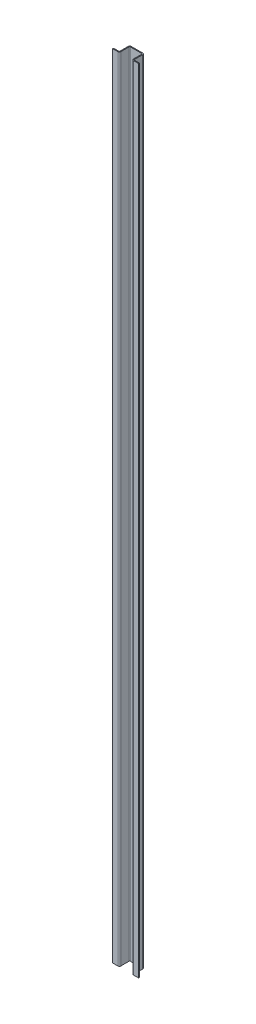
ISO-10303-21;
HEADER;
FILE_DESCRIPTION(('STEP AP214'),'2;1');
FILE_NAME('part.step','',(''),(''),'','','');
FILE_SCHEMA(('AUTOMOTIVE_DESIGN { 1 0 10303 214 1 1 1 1 }'));
ENDSEC;
DATA;
#1=APPLICATION_CONTEXT('core data for automotive mechanical design processes');
#2=APPLICATION_PROTOCOL_DEFINITION('international standard','automotive_design',2000,#1);
#3=PRODUCT_CONTEXT('',#1,'mechanical');
#4=PRODUCT('Part','Part','',(#3));
#5=PRODUCT_RELATED_PRODUCT_CATEGORY('part','',(#4));
#6=PRODUCT_DEFINITION_FORMATION('','',#4);
#7=PRODUCT_DEFINITION_CONTEXT('part definition',#1,'design');
#8=PRODUCT_DEFINITION('design','',#6,#7);
#9=PRODUCT_DEFINITION_SHAPE('','',#8);
#10=(LENGTH_UNIT() NAMED_UNIT(*) SI_UNIT(.MILLI.,.METRE.));
#11=(NAMED_UNIT(*) PLANE_ANGLE_UNIT() SI_UNIT($,.RADIAN.));
#12=(NAMED_UNIT(*) SI_UNIT($,.STERADIAN.) SOLID_ANGLE_UNIT());
#13=UNCERTAINTY_MEASURE_WITH_UNIT(LENGTH_MEASURE(1.E-05),#10,'distance_accuracy_value','');
#14=(GEOMETRIC_REPRESENTATION_CONTEXT(3) GLOBAL_UNCERTAINTY_ASSIGNED_CONTEXT((#13)) GLOBAL_UNIT_ASSIGNED_CONTEXT((#10,
#11,#12)) REPRESENTATION_CONTEXT('',''));
#15=CARTESIAN_POINT('',(0.,0.,0.));
#16=DIRECTION('',(0.,0.,1.));
#17=DIRECTION('',(1.,0.,0.));
#18=AXIS2_PLACEMENT_3D('',#15,#16,#17);
#19=CARTESIAN_POINT('',(-184.5,-687.500000000001,-18.5));
#20=DIRECTION('',(0.,1.,0.));
#21=DIRECTION('',(0.,0.,1.));
#22=AXIS2_PLACEMENT_3D('',#19,#20,#21);
#23=CYLINDRICAL_SURFACE('',#22,1.);
#24=DIRECTION('',(0.,1.,0.));
#25=VECTOR('',#24,1.);
#26=CARTESIAN_POINT('',(-184.5,-687.500000000001,-19.5));
#27=LINE('',#26,#25);
#28=CARTESIAN_POINT('',(-184.5,687.499999999999,-19.5));
#29=VERTEX_POINT('',#28);
#30=CARTESIAN_POINT('',(-184.5,-687.500000000001,-19.5));
#31=VERTEX_POINT('',#30);
#32=EDGE_CURVE('E135',#29,#31,#27,.F.);
#33=ORIENTED_EDGE('',*,*,#32,.T.);
#34=CARTESIAN_POINT('',(-184.5,-687.500000000001,-18.5));
#35=DIRECTION('',(0.,1.,0.));
#36=DIRECTION('',(0.,0.,1.));
#37=AXIS2_PLACEMENT_3D('',#34,#35,#36);
#38=CIRCLE('',#37,1.);
#39=CARTESIAN_POINT('',(-183.5,-687.500000000001,-18.5));
#40=VERTEX_POINT('',#39);
#41=EDGE_CURVE('E19',#40,#31,#38,.T.);
#42=ORIENTED_EDGE('',*,*,#41,.F.);
#43=DIRECTION('',(0.,1.,0.));
#44=VECTOR('',#43,1.);
#45=CARTESIAN_POINT('',(-183.5,-687.500000000001,-18.5));
#46=LINE('',#45,#44);
#47=CARTESIAN_POINT('',(-183.5,687.499999999999,-18.5));
#48=VERTEX_POINT('',#47);
#49=EDGE_CURVE('E132',#40,#48,#46,.T.);
#50=ORIENTED_EDGE('',*,*,#49,.T.);
#51=CARTESIAN_POINT('',(-184.5,687.499999999999,-18.5));
#52=DIRECTION('',(0.,1.,0.));
#53=DIRECTION('',(0.,0.,1.));
#54=AXIS2_PLACEMENT_3D('',#51,#52,#53);
#55=CIRCLE('',#54,1.);
#56=EDGE_CURVE('E140',#29,#48,#55,.F.);
#57=ORIENTED_EDGE('',*,*,#56,.F.);
#58=EDGE_LOOP('',(#33,#42,#50,#57));
#59=FACE_BOUND('',#58,.T.);
#60=ADVANCED_FACE('F16',(#59),#23,.F.);
#61=CARTESIAN_POINT('',(-172.,-687.500000000001,-1.5));
#62=DIRECTION('',(1.,0.,0.));
#63=DIRECTION('',(0.,0.,-1.));
#64=AXIS2_PLACEMENT_3D('',#61,#62,#63);
#65=PLANE('',#64);
#66=DIRECTION('',(0.,1.,0.));
#67=VECTOR('',#66,1.);
#68=CARTESIAN_POINT('',(-172.,-687.500000000001,-3.));
#69=LINE('',#68,#67);
#70=CARTESIAN_POINT('',(-172.,687.499999999999,-3.));
#71=VERTEX_POINT('',#70);
#72=CARTESIAN_POINT('',(-172.,-687.500000000001,-3.));
#73=VERTEX_POINT('',#72);
#74=EDGE_CURVE('E230',#71,#73,#69,.F.);
#75=ORIENTED_EDGE('',*,*,#74,.F.);
#76=DIRECTION('',(0.,0.,-1.));
#77=VECTOR('',#76,1.);
#78=CARTESIAN_POINT('',(-172.,687.499999999999,-1.5));
#79=LINE('',#78,#77);
#80=CARTESIAN_POINT('',(-172.,687.499999999999,-1.5));
#81=VERTEX_POINT('',#80);
#82=EDGE_CURVE('E259',#71,#81,#79,.F.);
#83=ORIENTED_EDGE('',*,*,#82,.T.);
#84=DIRECTION('',(0.,1.,0.));
#85=VECTOR('',#84,1.);
#86=CARTESIAN_POINT('',(-172.,-687.500000000001,-1.5));
#87=LINE('',#86,#85);
#88=CARTESIAN_POINT('',(-172.,-687.500000000001,-1.5));
#89=VERTEX_POINT('',#88);
#90=EDGE_CURVE('E237',#81,#89,#87,.F.);
#91=ORIENTED_EDGE('',*,*,#90,.T.);
#92=DIRECTION('',(0.,0.,-1.));
#93=VECTOR('',#92,1.);
#94=CARTESIAN_POINT('',(-172.,-687.500000000001,-1.5));
#95=LINE('',#94,#93);
#96=EDGE_CURVE('E263',#89,#73,#95,.T.);
#97=ORIENTED_EDGE('',*,*,#96,.T.);
#98=EDGE_LOOP('',(#75,#83,#91,#97));
#99=FACE_BOUND('',#98,.T.);
#100=ADVANCED_FACE('F345',(#99),#65,.T.);
#101=CARTESIAN_POINT('',(-181.,-687.500000000001,-4.));
#102=DIRECTION('',(0.,1.,0.));
#103=DIRECTION('',(0.,0.,1.));
#104=AXIS2_PLACEMENT_3D('',#101,#102,#103);
#105=CYLINDRICAL_SURFACE('',#104,1.);
#106=DIRECTION('',(0.,1.,0.));
#107=VECTOR('',#106,1.);
#108=CARTESIAN_POINT('',(-181.,-687.500000000001,-3.));
#109=LINE('',#108,#107);
#110=CARTESIAN_POINT('',(-181.,-687.500000000001,-3.));
#111=VERTEX_POINT('',#110);
#112=CARTESIAN_POINT('',(-181.,687.499999999999,-3.));
#113=VERTEX_POINT('',#112);
#114=EDGE_CURVE('E227',#111,#113,#109,.T.);
#115=ORIENTED_EDGE('',*,*,#114,.F.);
#116=CARTESIAN_POINT('',(-181.,-687.500000000001,-4.));
#117=DIRECTION('',(0.,1.,0.));
#118=DIRECTION('',(0.,0.,1.));
#119=AXIS2_PLACEMENT_3D('',#116,#117,#118);
#120=CIRCLE('',#119,1.);
#121=CARTESIAN_POINT('',(-182.,-687.500000000001,-4.));
#122=VERTEX_POINT('',#121);
#123=EDGE_CURVE('E262',#122,#111,#120,.T.);
#124=ORIENTED_EDGE('',*,*,#123,.F.);
#125=DIRECTION('',(0.,1.,0.));
#126=VECTOR('',#125,1.);
#127=CARTESIAN_POINT('',(-182.,-687.500000000001,-4.));
#128=LINE('',#127,#126);
#129=CARTESIAN_POINT('',(-182.,687.499999999999,-4.));
#130=VERTEX_POINT('',#129);
#131=EDGE_CURVE('E221',#130,#122,#128,.F.);
#132=ORIENTED_EDGE('',*,*,#131,.F.);
#133=CARTESIAN_POINT('',(-181.,687.499999999999,-4.));
#134=DIRECTION('',(0.,1.,0.));
#135=DIRECTION('',(0.,0.,1.));
#136=AXIS2_PLACEMENT_3D('',#133,#134,#135);
#137=CIRCLE('',#136,1.);
#138=EDGE_CURVE('E294',#113,#130,#137,.F.);
#139=ORIENTED_EDGE('',*,*,#138,.F.);
#140=EDGE_LOOP('',(#115,#124,#132,#139));
#141=FACE_BOUND('',#140,.T.);
#142=ADVANCED_FACE('F526',(#141),#105,.F.);
#143=CARTESIAN_POINT('',(-208.,-687.500000000001,-4.));
#144=DIRECTION('',(0.,1.,0.));
#145=DIRECTION('',(0.,0.,1.));
#146=AXIS2_PLACEMENT_3D('',#143,#144,#145);
#147=CYLINDRICAL_SURFACE('',#146,1.);
#148=DIRECTION('',(0.,1.,0.));
#149=VECTOR('',#148,1.);
#150=CARTESIAN_POINT('',(-207.,-687.500000000001,-4.));
#151=LINE('',#150,#149);
#152=CARTESIAN_POINT('',(-207.,-687.500000000001,-4.));
#153=VERTEX_POINT('',#152);
#154=CARTESIAN_POINT('',(-207.,687.499999999999,-4.));
#155=VERTEX_POINT('',#154);
#156=EDGE_CURVE('E214',#153,#155,#151,.T.);
#157=ORIENTED_EDGE('',*,*,#156,.F.);
#158=CARTESIAN_POINT('',(-208.,-687.500000000001,-4.));
#159=DIRECTION('',(0.,1.,0.));
#160=DIRECTION('',(0.,0.,1.));
#161=AXIS2_PLACEMENT_3D('',#158,#159,#160);
#162=CIRCLE('',#161,1.);
#163=CARTESIAN_POINT('',(-208.,-687.500000000001,-3.));
#164=VERTEX_POINT('',#163);
#165=EDGE_CURVE('E292',#164,#153,#162,.T.);
#166=ORIENTED_EDGE('',*,*,#165,.F.);
#167=DIRECTION('',(0.,1.,0.));
#168=VECTOR('',#167,1.);
#169=CARTESIAN_POINT('',(-208.,-687.500000000001,-3.));
#170=LINE('',#169,#168);
#171=CARTESIAN_POINT('',(-208.,687.499999999999,-3.));
#172=VERTEX_POINT('',#171);
#173=EDGE_CURVE('E211',#172,#164,#170,.F.);
#174=ORIENTED_EDGE('',*,*,#173,.F.);
#175=CARTESIAN_POINT('',(-208.,687.499999999999,-4.));
#176=DIRECTION('',(0.,1.,0.));
#177=DIRECTION('',(0.,0.,1.));
#178=AXIS2_PLACEMENT_3D('',#175,#176,#177);
#179=CIRCLE('',#178,1.);
#180=EDGE_CURVE('E251',#155,#172,#179,.F.);
#181=ORIENTED_EDGE('',*,*,#180,.F.);
#182=EDGE_LOOP('',(#157,#166,#174,#181));
#183=FACE_BOUND('',#182,.T.);
#184=ADVANCED_FACE('F401',(#183),#147,.F.);
#185=CARTESIAN_POINT('',(-217.,-687.500000000001,-3.));
#186=DIRECTION('',(-1.,0.,0.));
#187=DIRECTION('',(0.,0.,1.));
#188=AXIS2_PLACEMENT_3D('',#185,#186,#187);
#189=PLANE('',#188);
#190=DIRECTION('',(0.,1.,0.));
#191=VECTOR('',#190,1.);
#192=CARTESIAN_POINT('',(-217.,-687.500000000001,-1.5));
#193=LINE('',#192,#191);
#194=CARTESIAN_POINT('',(-217.,-687.500000000001,-1.5));
#195=VERTEX_POINT('',#194);
#196=CARTESIAN_POINT('',(-217.,687.499999999999,-1.5));
#197=VERTEX_POINT('',#196);
#198=EDGE_CURVE('E205',#195,#197,#193,.T.);
#199=ORIENTED_EDGE('',*,*,#198,.T.);
#200=DIRECTION('',(0.,0.,1.));
#201=VECTOR('',#200,1.);
#202=CARTESIAN_POINT('',(-217.,687.499999999999,-3.));
#203=LINE('',#202,#201);
#204=CARTESIAN_POINT('',(-217.,687.499999999999,-3.));
#205=VERTEX_POINT('',#204);
#206=EDGE_CURVE('E250',#197,#205,#203,.F.);
#207=ORIENTED_EDGE('',*,*,#206,.T.);
#208=DIRECTION('',(0.,1.,0.));
#209=VECTOR('',#208,1.);
#210=CARTESIAN_POINT('',(-217.,-687.500000000001,-3.));
#211=LINE('',#210,#209);
#212=CARTESIAN_POINT('',(-217.,-687.500000000001,-3.));
#213=VERTEX_POINT('',#212);
#214=EDGE_CURVE('E208',#213,#205,#211,.T.);
#215=ORIENTED_EDGE('',*,*,#214,.F.);
#216=DIRECTION('',(0.,0.,1.));
#217=VECTOR('',#216,1.);
#218=CARTESIAN_POINT('',(-217.,-687.500000000001,-3.));
#219=LINE('',#218,#217);
#220=EDGE_CURVE('E247',#213,#195,#219,.T.);
#221=ORIENTED_EDGE('',*,*,#220,.T.);
#222=EDGE_LOOP('',(#199,#207,#215,#221));
#223=FACE_BOUND('',#222,.T.);
#224=ADVANCED_FACE('F328',(#223),#189,.T.);
#225=CARTESIAN_POINT('',(-204.5,-687.500000000001,-18.5));
#226=DIRECTION('',(0.,1.,0.));
#227=DIRECTION('',(0.,0.,1.));
#228=AXIS2_PLACEMENT_3D('',#225,#226,#227);
#229=CYLINDRICAL_SURFACE('',#228,1.);
#230=DIRECTION('',(0.,1.,0.));
#231=VECTOR('',#230,1.);
#232=CARTESIAN_POINT('',(-205.5,-687.500000000001,-18.5));
#233=LINE('',#232,#231);
#234=CARTESIAN_POINT('',(-205.5,687.499999999999,-18.5));
#235=VERTEX_POINT('',#234);
#236=CARTESIAN_POINT('',(-205.5,-687.500000000001,-18.5));
#237=VERTEX_POINT('',#236);
#238=EDGE_CURVE('E200',#235,#237,#233,.F.);
#239=ORIENTED_EDGE('',*,*,#238,.T.);
#240=CARTESIAN_POINT('',(-204.5,-687.500000000001,-18.5));
#241=DIRECTION('',(0.,1.,0.));
#242=DIRECTION('',(0.,0.,1.));
#243=AXIS2_PLACEMENT_3D('',#240,#241,#242);
#244=CIRCLE('',#243,1.);
#245=CARTESIAN_POINT('',(-204.5,-687.500000000001,-19.5));
#246=VERTEX_POINT('',#245);
#247=EDGE_CURVE('E256',#246,#237,#244,.T.);
#248=ORIENTED_EDGE('',*,*,#247,.F.);
#249=DIRECTION('',(0.,1.,0.));
#250=VECTOR('',#249,1.);
#251=CARTESIAN_POINT('',(-204.5,-687.500000000001,-19.5));
#252=LINE('',#251,#250);
#253=CARTESIAN_POINT('',(-204.5,687.499999999999,-19.5));
#254=VERTEX_POINT('',#253);
#255=EDGE_CURVE('E149',#246,#254,#252,.T.);
#256=ORIENTED_EDGE('',*,*,#255,.T.);
#257=CARTESIAN_POINT('',(-204.5,687.499999999999,-18.5));
#258=DIRECTION('',(0.,1.,0.));
#259=DIRECTION('',(0.,0.,1.));
#260=AXIS2_PLACEMENT_3D('',#257,#258,#259);
#261=CIRCLE('',#260,1.);
#262=EDGE_CURVE('E246',#235,#254,#261,.F.);
#263=ORIENTED_EDGE('',*,*,#262,.F.);
#264=EDGE_LOOP('',(#239,#248,#256,#263));
#265=FACE_BOUND('',#264,.T.);
#266=ADVANCED_FACE('F307',(#265),#229,.F.);
#267=CARTESIAN_POINT('',(-182.,-687.500000000001,-19.5));
#268=DIRECTION('',(0.,0.,-1.));
#269=DIRECTION('',(-1.,0.,0.));
#270=AXIS2_PLACEMENT_3D('',#267,#268,#269);
#271=PLANE('',#270);
#272=ORIENTED_EDGE('',*,*,#255,.F.);
#273=DIRECTION('',(1.,0.,0.));
#274=VECTOR('',#273,1.);
#275=CARTESIAN_POINT('',(-183.5,-687.500000000001,-19.5));
#276=LINE('',#275,#274);
#277=EDGE_CURVE('E194',#31,#246,#276,.F.);
#278=ORIENTED_EDGE('',*,*,#277,.F.);
#279=ORIENTED_EDGE('',*,*,#32,.F.);
#280=DIRECTION('',(1.,0.,0.));
#281=VECTOR('',#280,1.);
#282=CARTESIAN_POINT('',(-205.5,687.499999999999,-19.5));
#283=LINE('',#282,#281);
#284=EDGE_CURVE('E223',#254,#29,#283,.T.);
#285=ORIENTED_EDGE('',*,*,#284,.F.);
#286=EDGE_LOOP('',(#272,#278,#279,#285));
#287=FACE_BOUND('',#286,.T.);
#288=ADVANCED_FACE('F303',(#287),#271,.F.);
#289=CARTESIAN_POINT('',(-183.5,-687.500000000001,-3.));
#290=DIRECTION('',(1.,0.,0.));
#291=DIRECTION('',(0.,0.,-1.));
#292=AXIS2_PLACEMENT_3D('',#289,#290,#291);
#293=PLANE('',#292);
#294=ORIENTED_EDGE('',*,*,#49,.F.);
#295=DIRECTION('',(0.,0.,-1.));
#296=VECTOR('',#295,1.);
#297=CARTESIAN_POINT('',(-183.5,-687.500000000001,-18.5));
#298=LINE('',#297,#296);
#299=CARTESIAN_POINT('',(-183.5,-687.500000000001,-4.));
#300=VERTEX_POINT('',#299);
#301=EDGE_CURVE('E144',#300,#40,#298,.T.);
#302=ORIENTED_EDGE('',*,*,#301,.F.);
#303=DIRECTION('',(0.,1.,0.));
#304=VECTOR('',#303,1.);
#305=CARTESIAN_POINT('',(-183.5,-687.500000000001,-4.));
#306=LINE('',#305,#304);
#307=CARTESIAN_POINT('',(-183.5,687.499999999999,-4.));
#308=VERTEX_POINT('',#307);
#309=EDGE_CURVE('E148',#308,#300,#306,.F.);
#310=ORIENTED_EDGE('',*,*,#309,.F.);
#311=DIRECTION('',(0.,0.,1.));
#312=VECTOR('',#311,1.);
#313=CARTESIAN_POINT('',(-183.5,687.499999999999,-18.5));
#314=LINE('',#313,#312);
#315=EDGE_CURVE('E147',#48,#308,#314,.T.);
#316=ORIENTED_EDGE('',*,*,#315,.F.);
#317=EDGE_LOOP('',(#294,#302,#310,#316));
#318=FACE_BOUND('',#317,.T.);
#319=ADVANCED_FACE('F143',(#318),#293,.F.);
#320=CARTESIAN_POINT('',(-181.,-687.500000000001,-4.));
#321=DIRECTION('',(0.,1.,0.));
#322=DIRECTION('',(0.,0.,1.));
#323=AXIS2_PLACEMENT_3D('',#320,#321,#322);
#324=CYLINDRICAL_SURFACE('',#323,2.5);
#325=DIRECTION('',(0.,1.,0.));
#326=VECTOR('',#325,1.);
#327=CARTESIAN_POINT('',(-181.,-687.500000000001,-1.5));
#328=LINE('',#327,#326);
#329=CARTESIAN_POINT('',(-181.,-687.500000000001,-1.5));
#330=VERTEX_POINT('',#329);
#331=CARTESIAN_POINT('',(-181.,687.499999999999,-1.5));
#332=VERTEX_POINT('',#331);
#333=EDGE_CURVE('E233',#330,#332,#328,.T.);
#334=ORIENTED_EDGE('',*,*,#333,.T.);
#335=CARTESIAN_POINT('',(-181.,687.499999999999,-4.));
#336=DIRECTION('',(0.,1.,0.));
#337=DIRECTION('',(0.,0.,1.));
#338=AXIS2_PLACEMENT_3D('',#335,#336,#337);
#339=CIRCLE('',#338,2.5);
#340=EDGE_CURVE('E281',#308,#332,#339,.T.);
#341=ORIENTED_EDGE('',*,*,#340,.F.);
#342=ORIENTED_EDGE('',*,*,#309,.T.);
#343=CARTESIAN_POINT('',(-181.,-687.500000000001,-4.));
#344=DIRECTION('',(0.,1.,0.));
#345=DIRECTION('',(0.,0.,1.));
#346=AXIS2_PLACEMENT_3D('',#343,#344,#345);
#347=CIRCLE('',#346,2.5);
#348=EDGE_CURVE('E154',#330,#300,#347,.F.);
#349=ORIENTED_EDGE('',*,*,#348,.F.);
#350=EDGE_LOOP('',(#334,#341,#342,#349));
#351=FACE_BOUND('',#350,.T.);
#352=ADVANCED_FACE('F352',(#351),#324,.T.);
#353=CARTESIAN_POINT('',(-172.,-687.500000000001,-1.5));
#354=DIRECTION('',(0.,0.,-1.));
#355=DIRECTION('',(-1.,0.,0.));
#356=AXIS2_PLACEMENT_3D('',#353,#354,#355);
#357=PLANE('',#356);
#358=ORIENTED_EDGE('',*,*,#333,.F.);
#359=DIRECTION('',(1.,0.,0.));
#360=VECTOR('',#359,1.);
#361=CARTESIAN_POINT('',(-183.5,-687.500000000001,-1.5));
#362=LINE('',#361,#360);
#363=EDGE_CURVE('E160',#89,#330,#362,.F.);
#364=ORIENTED_EDGE('',*,*,#363,.F.);
#365=ORIENTED_EDGE('',*,*,#90,.F.);
#366=DIRECTION('',(1.,0.,0.));
#367=VECTOR('',#366,1.);
#368=CARTESIAN_POINT('',(-205.5,687.499999999999,-1.5));
#369=LINE('',#368,#367);
#370=EDGE_CURVE('E283',#332,#81,#369,.T.);
#371=ORIENTED_EDGE('',*,*,#370,.F.);
#372=EDGE_LOOP('',(#358,#364,#365,#371));
#373=FACE_BOUND('',#372,.T.);
#374=ADVANCED_FACE('F349',(#373),#357,.F.);
#375=CARTESIAN_POINT('',(-172.,-687.500000000001,-3.));
#376=DIRECTION('',(0.,0.,-1.));
#377=DIRECTION('',(-1.,0.,0.));
#378=AXIS2_PLACEMENT_3D('',#375,#376,#377);
#379=PLANE('',#378);
#380=ORIENTED_EDGE('',*,*,#114,.T.);
#381=DIRECTION('',(1.,0.,0.));
#382=VECTOR('',#381,1.);
#383=CARTESIAN_POINT('',(-205.5,687.499999999999,-3.));
#384=LINE('',#383,#382);
#385=EDGE_CURVE('E354',#71,#113,#384,.F.);
#386=ORIENTED_EDGE('',*,*,#385,.F.);
#387=ORIENTED_EDGE('',*,*,#74,.T.);
#388=DIRECTION('',(1.,0.,0.));
#389=VECTOR('',#388,1.);
#390=CARTESIAN_POINT('',(-183.5,-687.500000000001,-3.));
#391=LINE('',#390,#389);
#392=EDGE_CURVE('E167',#111,#73,#391,.T.);
#393=ORIENTED_EDGE('',*,*,#392,.F.);
#394=EDGE_LOOP('',(#380,#386,#387,#393));
#395=FACE_BOUND('',#394,.T.);
#396=ADVANCED_FACE('F476',(#395),#379,.T.);
#397=CARTESIAN_POINT('',(-182.,-687.500000000001,-3.));
#398=DIRECTION('',(1.,0.,0.));
#399=DIRECTION('',(0.,0.,-1.));
#400=AXIS2_PLACEMENT_3D('',#397,#398,#399);
#401=PLANE('',#400);
#402=DIRECTION('',(0.,1.,0.));
#403=VECTOR('',#402,1.);
#404=CARTESIAN_POINT('',(-182.,-687.500000000001,-18.5));
#405=LINE('',#404,#403);
#406=CARTESIAN_POINT('',(-182.,687.499999999999,-18.5));
#407=VERTEX_POINT('',#406);
#408=CARTESIAN_POINT('',(-182.,-687.500000000001,-18.5));
#409=VERTEX_POINT('',#408);
#410=EDGE_CURVE('E196',#407,#409,#405,.F.);
#411=ORIENTED_EDGE('',*,*,#410,.F.);
#412=DIRECTION('',(0.,0.,1.));
#413=VECTOR('',#412,1.);
#414=CARTESIAN_POINT('',(-182.,687.499999999999,-18.5));
#415=LINE('',#414,#413);
#416=EDGE_CURVE('E280',#130,#407,#415,.F.);
#417=ORIENTED_EDGE('',*,*,#416,.F.);
#418=ORIENTED_EDGE('',*,*,#131,.T.);
#419=DIRECTION('',(0.,0.,-1.));
#420=VECTOR('',#419,1.);
#421=CARTESIAN_POINT('',(-182.,-687.500000000001,-18.5));
#422=LINE('',#421,#420);
#423=EDGE_CURVE('E172',#409,#122,#422,.F.);
#424=ORIENTED_EDGE('',*,*,#423,.F.);
#425=EDGE_LOOP('',(#411,#417,#418,#424));
#426=FACE_BOUND('',#425,.T.);
#427=ADVANCED_FACE('F385',(#426),#401,.T.);
#428=CARTESIAN_POINT('',(-207.,-687.500000000001,-21.));
#429=DIRECTION('',(-1.,0.,0.));
#430=DIRECTION('',(0.,0.,1.));
#431=AXIS2_PLACEMENT_3D('',#428,#429,#430);
#432=PLANE('',#431);
#433=ORIENTED_EDGE('',*,*,#156,.T.);
#434=DIRECTION('',(0.,0.,1.));
#435=VECTOR('',#434,1.);
#436=CARTESIAN_POINT('',(-207.,687.499999999999,-18.5));
#437=LINE('',#436,#435);
#438=CARTESIAN_POINT('',(-207.,687.499999999999,-18.5));
#439=VERTEX_POINT('',#438);
#440=EDGE_CURVE('E276',#439,#155,#437,.T.);
#441=ORIENTED_EDGE('',*,*,#440,.F.);
#442=DIRECTION('',(0.,1.,0.));
#443=VECTOR('',#442,1.);
#444=CARTESIAN_POINT('',(-207.,-687.500000000001,-18.5));
#445=LINE('',#444,#443);
#446=CARTESIAN_POINT('',(-207.,-687.500000000001,-18.5));
#447=VERTEX_POINT('',#446);
#448=EDGE_CURVE('E158',#447,#439,#445,.T.);
#449=ORIENTED_EDGE('',*,*,#448,.F.);
#450=DIRECTION('',(0.,0.,-1.));
#451=VECTOR('',#450,1.);
#452=CARTESIAN_POINT('',(-207.,-687.500000000001,-18.5));
#453=LINE('',#452,#451);
#454=EDGE_CURVE('E178',#153,#447,#453,.T.);
#455=ORIENTED_EDGE('',*,*,#454,.F.);
#456=EDGE_LOOP('',(#433,#441,#449,#455));
#457=FACE_BOUND('',#456,.T.);
#458=ADVANCED_FACE('F396',(#457),#432,.T.);
#459=CARTESIAN_POINT('',(-207.,-687.500000000001,-3.));
#460=DIRECTION('',(0.,0.,-1.));
#461=DIRECTION('',(-1.,0.,0.));
#462=AXIS2_PLACEMENT_3D('',#459,#460,#461);
#463=PLANE('',#462);
#464=ORIENTED_EDGE('',*,*,#214,.T.);
#465=DIRECTION('',(1.,0.,0.));
#466=VECTOR('',#465,1.);
#467=CARTESIAN_POINT('',(-205.5,687.499999999999,-3.));
#468=LINE('',#467,#466);
#469=EDGE_CURVE('E372',#172,#205,#468,.F.);
#470=ORIENTED_EDGE('',*,*,#469,.F.);
#471=ORIENTED_EDGE('',*,*,#173,.T.);
#472=DIRECTION('',(1.,0.,0.));
#473=VECTOR('',#472,1.);
#474=CARTESIAN_POINT('',(-183.5,-687.500000000001,-3.));
#475=LINE('',#474,#473);
#476=EDGE_CURVE('E180',#213,#164,#475,.T.);
#477=ORIENTED_EDGE('',*,*,#476,.F.);
#478=EDGE_LOOP('',(#464,#470,#471,#477));
#479=FACE_BOUND('',#478,.T.);
#480=ADVANCED_FACE('F404',(#479),#463,.T.);
#481=CARTESIAN_POINT('',(-207.,-687.500000000001,-1.5));
#482=DIRECTION('',(0.,0.,-1.));
#483=DIRECTION('',(-1.,0.,0.));
#484=AXIS2_PLACEMENT_3D('',#481,#482,#483);
#485=PLANE('',#484);
#486=ORIENTED_EDGE('',*,*,#198,.F.);
#487=DIRECTION('',(1.,0.,0.));
#488=VECTOR('',#487,1.);
#489=CARTESIAN_POINT('',(-183.5,-687.500000000001,-1.5));
#490=LINE('',#489,#488);
#491=CARTESIAN_POINT('',(-208.,-687.500000000001,-1.5));
#492=VERTEX_POINT('',#491);
#493=EDGE_CURVE('E183',#492,#195,#490,.F.);
#494=ORIENTED_EDGE('',*,*,#493,.F.);
#495=DIRECTION('',(0.,1.,0.));
#496=VECTOR('',#495,1.);
#497=CARTESIAN_POINT('',(-208.,-687.500000000001,-1.5));
#498=LINE('',#497,#496);
#499=CARTESIAN_POINT('',(-208.,687.499999999999,-1.5));
#500=VERTEX_POINT('',#499);
#501=EDGE_CURVE('E203',#500,#492,#498,.F.);
#502=ORIENTED_EDGE('',*,*,#501,.F.);
#503=DIRECTION('',(1.,0.,0.));
#504=VECTOR('',#503,1.);
#505=CARTESIAN_POINT('',(-205.5,687.499999999999,-1.5));
#506=LINE('',#505,#504);
#507=EDGE_CURVE('E274',#197,#500,#506,.T.);
#508=ORIENTED_EDGE('',*,*,#507,.F.);
#509=EDGE_LOOP('',(#486,#494,#502,#508));
#510=FACE_BOUND('',#509,.T.);
#511=ADVANCED_FACE('F322',(#510),#485,.F.);
#512=CARTESIAN_POINT('',(-208.,-687.500000000001,-4.));
#513=DIRECTION('',(0.,1.,0.));
#514=DIRECTION('',(0.,0.,1.));
#515=AXIS2_PLACEMENT_3D('',#512,#513,#514);
#516=CYLINDRICAL_SURFACE('',#515,2.5);
#517=DIRECTION('',(0.,1.,0.));
#518=VECTOR('',#517,1.);
#519=CARTESIAN_POINT('',(-205.5,-687.500000000001,-4.));
#520=LINE('',#519,#518);
#521=CARTESIAN_POINT('',(-205.5,-687.500000000001,-4.));
#522=VERTEX_POINT('',#521);
#523=CARTESIAN_POINT('',(-205.5,687.499999999999,-4.));
#524=VERTEX_POINT('',#523);
#525=EDGE_CURVE('E197',#522,#524,#520,.T.);
#526=ORIENTED_EDGE('',*,*,#525,.T.);
#527=CARTESIAN_POINT('',(-208.,687.499999999999,-4.));
#528=DIRECTION('',(0.,1.,0.));
#529=DIRECTION('',(0.,0.,1.));
#530=AXIS2_PLACEMENT_3D('',#527,#528,#529);
#531=CIRCLE('',#530,2.5);
#532=EDGE_CURVE('E270',#500,#524,#531,.T.);
#533=ORIENTED_EDGE('',*,*,#532,.F.);
#534=ORIENTED_EDGE('',*,*,#501,.T.);
#535=CARTESIAN_POINT('',(-208.,-687.500000000001,-4.));
#536=DIRECTION('',(0.,1.,0.));
#537=DIRECTION('',(0.,0.,1.));
#538=AXIS2_PLACEMENT_3D('',#535,#536,#537);
#539=CIRCLE('',#538,2.5);
#540=EDGE_CURVE('E188',#522,#492,#539,.F.);
#541=ORIENTED_EDGE('',*,*,#540,.F.);
#542=EDGE_LOOP('',(#526,#533,#534,#541));
#543=FACE_BOUND('',#542,.T.);
#544=ADVANCED_FACE('F314',(#543),#516,.T.);
#545=CARTESIAN_POINT('',(-205.5,-687.500000000001,-21.));
#546=DIRECTION('',(-1.,0.,0.));
#547=DIRECTION('',(0.,0.,1.));
#548=AXIS2_PLACEMENT_3D('',#545,#546,#547);
#549=PLANE('',#548);
#550=ORIENTED_EDGE('',*,*,#525,.F.);
#551=DIRECTION('',(0.,0.,-1.));
#552=VECTOR('',#551,1.);
#553=CARTESIAN_POINT('',(-205.5,-687.500000000001,-18.5));
#554=LINE('',#553,#552);
#555=EDGE_CURVE('E191',#237,#522,#554,.F.);
#556=ORIENTED_EDGE('',*,*,#555,.F.);
#557=ORIENTED_EDGE('',*,*,#238,.F.);
#558=DIRECTION('',(0.,0.,1.));
#559=VECTOR('',#558,1.);
#560=CARTESIAN_POINT('',(-205.5,687.499999999999,-18.5));
#561=LINE('',#560,#559);
#562=EDGE_CURVE('E273',#524,#235,#561,.F.);
#563=ORIENTED_EDGE('',*,*,#562,.F.);
#564=EDGE_LOOP('',(#550,#556,#557,#563));
#565=FACE_BOUND('',#564,.T.);
#566=ADVANCED_FACE('F310',(#565),#549,.F.);
#567=CARTESIAN_POINT('',(-184.5,-687.500000000001,-18.5));
#568=DIRECTION('',(0.,1.,0.));
#569=DIRECTION('',(0.,0.,1.));
#570=AXIS2_PLACEMENT_3D('',#567,#568,#569);
#571=CYLINDRICAL_SURFACE('',#570,2.5);
#572=DIRECTION('',(0.,1.,0.));
#573=VECTOR('',#572,1.);
#574=CARTESIAN_POINT('',(-184.5,-687.500000000001,-21.));
#575=LINE('',#574,#573);
#576=CARTESIAN_POINT('',(-184.5,687.499999999999,-21.));
#577=VERTEX_POINT('',#576);
#578=CARTESIAN_POINT('',(-184.5,-687.500000000001,-21.));
#579=VERTEX_POINT('',#578);
#580=EDGE_CURVE('E365',#577,#579,#575,.F.);
#581=ORIENTED_EDGE('',*,*,#580,.F.);
#582=CARTESIAN_POINT('',(-184.5,687.499999999999,-18.5));
#583=DIRECTION('',(0.,1.,0.));
#584=DIRECTION('',(0.,0.,1.));
#585=AXIS2_PLACEMENT_3D('',#582,#583,#584);
#586=CIRCLE('',#585,2.5);
#587=EDGE_CURVE('E277',#407,#577,#586,.T.);
#588=ORIENTED_EDGE('',*,*,#587,.F.);
#589=ORIENTED_EDGE('',*,*,#410,.T.);
#590=CARTESIAN_POINT('',(-184.5,-687.500000000001,-18.5));
#591=DIRECTION('',(0.,1.,0.));
#592=DIRECTION('',(0.,0.,1.));
#593=AXIS2_PLACEMENT_3D('',#590,#591,#592);
#594=CIRCLE('',#593,2.5);
#595=EDGE_CURVE('E177',#579,#409,#594,.F.);
#596=ORIENTED_EDGE('',*,*,#595,.F.);
#597=EDGE_LOOP('',(#581,#588,#589,#596));
#598=FACE_BOUND('',#597,.T.);
#599=ADVANCED_FACE('F388',(#598),#571,.T.);
#600=CARTESIAN_POINT('',(-183.5,-687.500000000001,-18.5));
#601=DIRECTION('',(0.,-1.,0.));
#602=DIRECTION('',(0.,0.,-1.));
#603=AXIS2_PLACEMENT_3D('',#600,#601,#602);
#604=PLANE('',#603);
#605=ORIENTED_EDGE('',*,*,#301,.T.);
#606=ORIENTED_EDGE('',*,*,#41,.T.);
#607=ORIENTED_EDGE('',*,*,#277,.T.);
#608=ORIENTED_EDGE('',*,*,#247,.T.);
#609=ORIENTED_EDGE('',*,*,#555,.T.);
#610=ORIENTED_EDGE('',*,*,#540,.T.);
#611=ORIENTED_EDGE('',*,*,#493,.T.);
#612=ORIENTED_EDGE('',*,*,#220,.F.);
#613=ORIENTED_EDGE('',*,*,#476,.T.);
#614=ORIENTED_EDGE('',*,*,#165,.T.);
#615=ORIENTED_EDGE('',*,*,#454,.T.);
#616=CARTESIAN_POINT('',(-204.5,-687.500000000001,-18.5));
#617=DIRECTION('',(0.,1.,0.));
#618=DIRECTION('',(0.,0.,1.));
#619=AXIS2_PLACEMENT_3D('',#616,#617,#618);
#620=CIRCLE('',#619,2.5);
#621=CARTESIAN_POINT('',(-204.5,-687.500000000001,-21.));
#622=VERTEX_POINT('',#621);
#623=EDGE_CURVE('E155',#622,#447,#620,.T.);
#624=ORIENTED_EDGE('',*,*,#623,.F.);
#625=DIRECTION('',(-1.,0.,0.));
#626=VECTOR('',#625,1.);
#627=CARTESIAN_POINT('',(-182.,-687.500000000001,-21.));
#628=LINE('',#627,#626);
#629=EDGE_CURVE('E164',#579,#622,#628,.T.);
#630=ORIENTED_EDGE('',*,*,#629,.F.);
#631=ORIENTED_EDGE('',*,*,#595,.T.);
#632=ORIENTED_EDGE('',*,*,#423,.T.);
#633=ORIENTED_EDGE('',*,*,#123,.T.);
#634=ORIENTED_EDGE('',*,*,#392,.T.);
#635=ORIENTED_EDGE('',*,*,#96,.F.);
#636=ORIENTED_EDGE('',*,*,#363,.T.);
#637=ORIENTED_EDGE('',*,*,#348,.T.);
#638=EDGE_LOOP('',(#605,#606,#607,#608,#609,#610,#611,#612,#613,#614,#615,#624,#630,#631,#632,
#633,#634,#635,#636,#637));
#639=FACE_BOUND('',#638,.T.);
#640=ADVANCED_FACE('F151',(#639),#604,.T.);
#641=CARTESIAN_POINT('',(-204.5,-687.500000000001,-18.5));
#642=DIRECTION('',(0.,1.,0.));
#643=DIRECTION('',(0.,0.,1.));
#644=AXIS2_PLACEMENT_3D('',#641,#642,#643);
#645=CYLINDRICAL_SURFACE('',#644,2.5);
#646=ORIENTED_EDGE('',*,*,#448,.T.);
#647=CARTESIAN_POINT('',(-204.5,687.499999999999,-18.5));
#648=DIRECTION('',(0.,1.,0.));
#649=DIRECTION('',(0.,0.,1.));
#650=AXIS2_PLACEMENT_3D('',#647,#648,#649);
#651=CIRCLE('',#650,2.5);
#652=CARTESIAN_POINT('',(-204.5,687.499999999999,-21.));
#653=VERTEX_POINT('',#652);
#654=EDGE_CURVE('E34',#653,#439,#651,.T.);
#655=ORIENTED_EDGE('',*,*,#654,.F.);
#656=DIRECTION('',(0.,1.,0.));
#657=VECTOR('',#656,1.);
#658=CARTESIAN_POINT('',(-204.5,-687.500000000001,-21.));
#659=LINE('',#658,#657);
#660=EDGE_CURVE('E25',#622,#653,#659,.T.);
#661=ORIENTED_EDGE('',*,*,#660,.F.);
#662=ORIENTED_EDGE('',*,*,#623,.T.);
#663=EDGE_LOOP('',(#646,#655,#661,#662));
#664=FACE_BOUND('',#663,.T.);
#665=ADVANCED_FACE('F391',(#664),#645,.T.);
#666=CARTESIAN_POINT('',(-205.5,687.499999999999,-18.5));
#667=DIRECTION('',(0.,1.,0.));
#668=DIRECTION('',(0.,0.,1.));
#669=AXIS2_PLACEMENT_3D('',#666,#667,#668);
#670=PLANE('',#669);
#671=ORIENTED_EDGE('',*,*,#562,.T.);
#672=ORIENTED_EDGE('',*,*,#262,.T.);
#673=ORIENTED_EDGE('',*,*,#284,.T.);
#674=ORIENTED_EDGE('',*,*,#56,.T.);
#675=ORIENTED_EDGE('',*,*,#315,.T.);
#676=ORIENTED_EDGE('',*,*,#340,.T.);
#677=ORIENTED_EDGE('',*,*,#370,.T.);
#678=ORIENTED_EDGE('',*,*,#82,.F.);
#679=ORIENTED_EDGE('',*,*,#385,.T.);
#680=ORIENTED_EDGE('',*,*,#138,.T.);
#681=ORIENTED_EDGE('',*,*,#416,.T.);
#682=ORIENTED_EDGE('',*,*,#587,.T.);
#683=DIRECTION('',(-1.,0.,0.));
#684=VECTOR('',#683,1.);
#685=CARTESIAN_POINT('',(-182.,687.499999999999,-21.));
#686=LINE('',#685,#684);
#687=EDGE_CURVE('E11',#653,#577,#686,.F.);
#688=ORIENTED_EDGE('',*,*,#687,.F.);
#689=ORIENTED_EDGE('',*,*,#654,.T.);
#690=ORIENTED_EDGE('',*,*,#440,.T.);
#691=ORIENTED_EDGE('',*,*,#180,.T.);
#692=ORIENTED_EDGE('',*,*,#469,.T.);
#693=ORIENTED_EDGE('',*,*,#206,.F.);
#694=ORIENTED_EDGE('',*,*,#507,.T.);
#695=ORIENTED_EDGE('',*,*,#532,.T.);
#696=EDGE_LOOP('',(#671,#672,#673,#674,#675,#676,#677,#678,#679,#680,#681,#682,#688,#689,#690,
#691,#692,#693,#694,#695));
#697=FACE_BOUND('',#696,.T.);
#698=ADVANCED_FACE('F299',(#697),#670,.T.);
#699=CARTESIAN_POINT('',(-182.,-687.500000000001,-21.));
#700=DIRECTION('',(0.,0.,-1.));
#701=DIRECTION('',(-1.,0.,0.));
#702=AXIS2_PLACEMENT_3D('',#699,#700,#701);
#703=PLANE('',#702);
#704=ORIENTED_EDGE('',*,*,#660,.T.);
#705=ORIENTED_EDGE('',*,*,#687,.T.);
#706=ORIENTED_EDGE('',*,*,#580,.T.);
#707=ORIENTED_EDGE('',*,*,#629,.T.);
#708=EDGE_LOOP('',(#704,#705,#706,#707));
#709=FACE_BOUND('',#708,.T.);
#710=ADVANCED_FACE('F390',(#709),#703,.T.);
#711=CLOSED_SHELL('',(#60,#100,#142,#184,#224,#266,#288,#319,#352,#374,#396,#427,#458,#480,#511,
#544,#566,#599,#640,#665,#698,#710));
#712=MANIFOLD_SOLID_BREP('B1',#711);
#713=ADVANCED_BREP_SHAPE_REPRESENTATION('',(#18,#712),#14);
#714=SHAPE_DEFINITION_REPRESENTATION(#9,#713);
ENDSEC;
END-ISO-10303-21;
